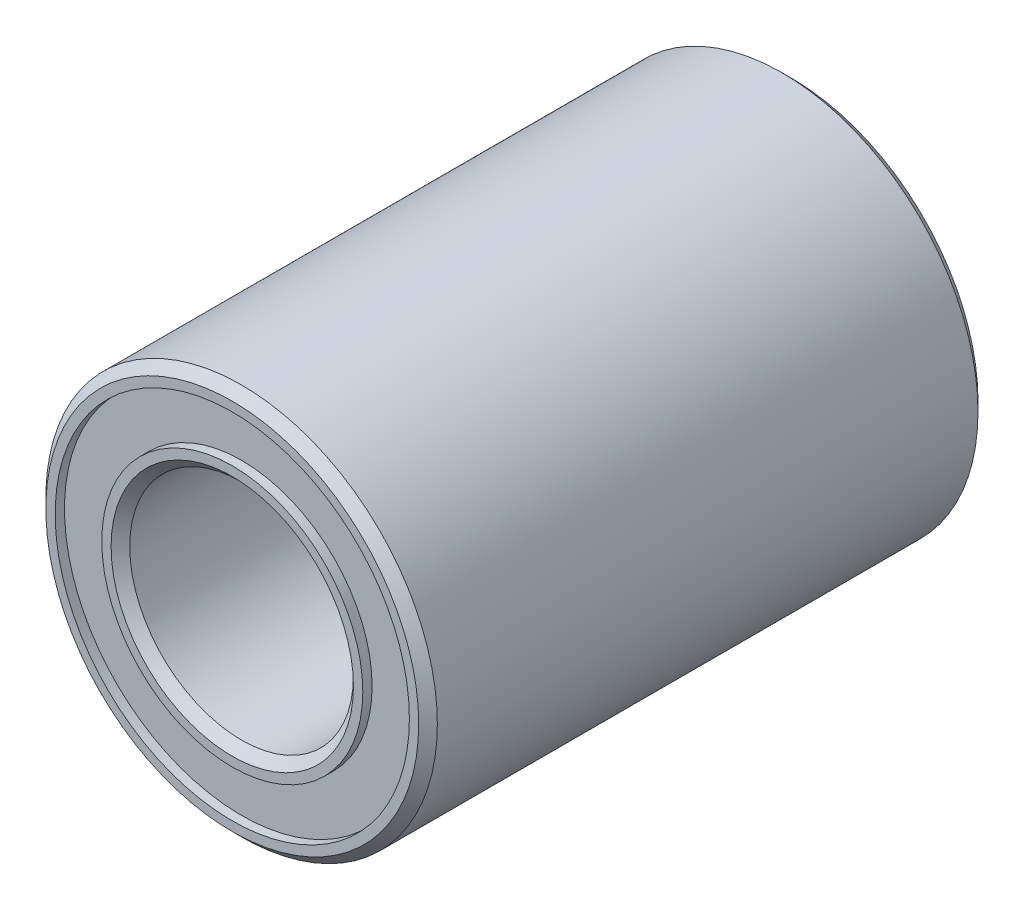
ISO-10303-21;
HEADER;
FILE_DESCRIPTION(('STEP AP214'),'2;1');
FILE_NAME('part.step','',(''),(''),'','','');
FILE_SCHEMA(('AUTOMOTIVE_DESIGN { 1 0 10303 214 1 1 1 1 }'));
ENDSEC;
DATA;
#1=APPLICATION_CONTEXT('core data for automotive mechanical design processes');
#2=APPLICATION_PROTOCOL_DEFINITION('international standard','automotive_design',2000,#1);
#3=PRODUCT_CONTEXT('',#1,'mechanical');
#4=PRODUCT('Part','Part','',(#3));
#5=PRODUCT_RELATED_PRODUCT_CATEGORY('part','',(#4));
#6=PRODUCT_DEFINITION_FORMATION('','',#4);
#7=PRODUCT_DEFINITION_CONTEXT('part definition',#1,'design');
#8=PRODUCT_DEFINITION('design','',#6,#7);
#9=PRODUCT_DEFINITION_SHAPE('','',#8);
#10=(LENGTH_UNIT() NAMED_UNIT(*) SI_UNIT(.MILLI.,.METRE.));
#11=(NAMED_UNIT(*) PLANE_ANGLE_UNIT() SI_UNIT($,.RADIAN.));
#12=(NAMED_UNIT(*) SI_UNIT($,.STERADIAN.) SOLID_ANGLE_UNIT());
#13=UNCERTAINTY_MEASURE_WITH_UNIT(LENGTH_MEASURE(1.E-05),#10,'distance_accuracy_value','');
#14=(GEOMETRIC_REPRESENTATION_CONTEXT(3) GLOBAL_UNCERTAINTY_ASSIGNED_CONTEXT((#13)) GLOBAL_UNIT_ASSIGNED_CONTEXT((#10,
#11,#12)) REPRESENTATION_CONTEXT('',''));
#15=CARTESIAN_POINT('',(0.,0.,0.));
#16=DIRECTION('',(0.,0.,1.));
#17=DIRECTION('',(1.,0.,0.));
#18=AXIS2_PLACEMENT_3D('',#15,#16,#17);
#19=CARTESIAN_POINT('',(0.,0.,0.));
#20=DIRECTION('',(0.,0.,1.));
#21=DIRECTION('',(1.,0.,0.));
#22=AXIS2_PLACEMENT_3D('',#19,#20,#21);
#23=PLANE('',#22);
#24=CARTESIAN_POINT('',(0.,0.,0.));
#25=DIRECTION('',(0.,0.,1.));
#26=DIRECTION('',(1.,0.,0.));
#27=AXIS2_PLACEMENT_3D('',#24,#25,#26);
#28=CIRCLE('',#27,6.5);
#29=CARTESIAN_POINT('',(6.5,0.,0.));
#30=VERTEX_POINT('',#29);
#31=EDGE_CURVE('E72',#30,#30,#28,.T.);
#32=ORIENTED_EDGE('',*,*,#31,.T.);
#33=EDGE_LOOP('',(#32));
#34=FACE_BOUND('',#33,.T.);
#35=CARTESIAN_POINT('',(0.,0.,0.));
#36=DIRECTION('',(0.,0.,-1.));
#37=DIRECTION('',(-1.,0.,0.));
#38=AXIS2_PLACEMENT_3D('',#35,#36,#37);
#39=CIRCLE('',#38,7.);
#40=CARTESIAN_POINT('',(-7.,0.,0.));
#41=VERTEX_POINT('',#40);
#42=EDGE_CURVE('E94',#41,#41,#39,.T.);
#43=ORIENTED_EDGE('',*,*,#42,.T.);
#44=EDGE_LOOP('',(#43));
#45=FACE_BOUND('',#44,.T.);
#46=ADVANCED_FACE('F43',(#34,#45),#23,.F.);
#47=CARTESIAN_POINT('',(0.,0.,30.));
#48=DIRECTION('',(0.,0.,1.));
#49=DIRECTION('',(1.,0.,0.));
#50=AXIS2_PLACEMENT_3D('',#47,#48,#49);
#51=PLANE('',#50);
#52=CARTESIAN_POINT('',(0.,0.,30.));
#53=DIRECTION('',(0.,0.,1.));
#54=DIRECTION('',(1.,0.,0.));
#55=AXIS2_PLACEMENT_3D('',#52,#53,#54);
#56=CIRCLE('',#55,6.5);
#57=CARTESIAN_POINT('',(6.5,0.,30.));
#58=VERTEX_POINT('',#57);
#59=EDGE_CURVE('E63',#58,#58,#56,.F.);
#60=ORIENTED_EDGE('',*,*,#59,.T.);
#61=EDGE_LOOP('',(#60));
#62=FACE_BOUND('',#61,.T.);
#63=CARTESIAN_POINT('',(0.,0.,30.));
#64=DIRECTION('',(0.,0.,1.));
#65=DIRECTION('',(1.,0.,0.));
#66=AXIS2_PLACEMENT_3D('',#63,#64,#65);
#67=CIRCLE('',#66,7.);
#68=CARTESIAN_POINT('',(7.,0.,30.));
#69=VERTEX_POINT('',#68);
#70=EDGE_CURVE('E82',#69,#69,#67,.T.);
#71=ORIENTED_EDGE('',*,*,#70,.T.);
#72=EDGE_LOOP('',(#71));
#73=FACE_BOUND('',#72,.T.);
#74=ADVANCED_FACE('F128',(#62,#73),#51,.T.);
#75=CARTESIAN_POINT('',(0.,0.,30.));
#76=DIRECTION('',(0.,0.,1.));
#77=DIRECTION('',(1.,0.,0.));
#78=AXIS2_PLACEMENT_3D('',#75,#76,#77);
#79=CIRCLE('',#78,10.);
#80=CARTESIAN_POINT('',(10.,0.,30.));
#81=VERTEX_POINT('',#80);
#82=EDGE_CURVE('E10',#81,#81,#79,.T.);
#83=ORIENTED_EDGE('',*,*,#82,.T.);
#84=EDGE_LOOP('',(#83));
#85=FACE_BOUND('',#84,.T.);
#86=CARTESIAN_POINT('',(0.,0.,30.));
#87=DIRECTION('',(0.,0.,1.));
#88=DIRECTION('',(1.,0.,0.));
#89=AXIS2_PLACEMENT_3D('',#86,#87,#88);
#90=CIRCLE('',#89,9.5);
#91=CARTESIAN_POINT('',(9.5,0.,30.));
#92=VERTEX_POINT('',#91);
#93=EDGE_CURVE('E76',#92,#92,#90,.T.);
#94=ORIENTED_EDGE('',*,*,#93,.F.);
#95=EDGE_LOOP('',(#94));
#96=FACE_BOUND('',#95,.T.);
#97=ADVANCED_FACE('F119',(#85,#96),#51,.T.);
#98=CARTESIAN_POINT('',(0.,0.,0.));
#99=DIRECTION('',(0.,0.,1.));
#100=DIRECTION('',(1.,0.,0.));
#101=AXIS2_PLACEMENT_3D('',#98,#99,#100);
#102=CIRCLE('',#101,10.);
#103=CARTESIAN_POINT('',(10.,0.,0.));
#104=VERTEX_POINT('',#103);
#105=EDGE_CURVE('E50',#104,#104,#102,.F.);
#106=ORIENTED_EDGE('',*,*,#105,.T.);
#107=EDGE_LOOP('',(#106));
#108=FACE_BOUND('',#107,.T.);
#109=CARTESIAN_POINT('',(0.,0.,0.));
#110=DIRECTION('',(0.,0.,-1.));
#111=DIRECTION('',(-1.,0.,0.));
#112=AXIS2_PLACEMENT_3D('',#109,#110,#111);
#113=CIRCLE('',#112,9.5);
#114=CARTESIAN_POINT('',(-9.5,0.,0.));
#115=VERTEX_POINT('',#114);
#116=EDGE_CURVE('E88',#115,#115,#113,.T.);
#117=ORIENTED_EDGE('',*,*,#116,.F.);
#118=EDGE_LOOP('',(#117));
#119=FACE_BOUND('',#118,.T.);
#120=ADVANCED_FACE('F116',(#108,#119),#23,.F.);
#121=CARTESIAN_POINT('',(0.,0.,30.));
#122=DIRECTION('',(0.,0.,-1.));
#123=DIRECTION('',(-1.,0.,0.));
#124=AXIS2_PLACEMENT_3D('',#121,#122,#123);
#125=CYLINDRICAL_SURFACE('',#124,10.5);
#126=CARTESIAN_POINT('',(0.,0.,0.5));
#127=DIRECTION('',(0.,0.,1.));
#128=DIRECTION('',(1.,0.,0.));
#129=AXIS2_PLACEMENT_3D('',#126,#127,#128);
#130=CIRCLE('',#129,10.5);
#131=CARTESIAN_POINT('',(10.5,0.,0.5));
#132=VERTEX_POINT('',#131);
#133=EDGE_CURVE('E54',#132,#132,#130,.T.);
#134=ORIENTED_EDGE('',*,*,#133,.T.);
#135=EDGE_LOOP('',(#134));
#136=FACE_BOUND('',#135,.T.);
#137=CARTESIAN_POINT('',(0.,0.,29.5));
#138=DIRECTION('',(0.,0.,1.));
#139=DIRECTION('',(1.,0.,0.));
#140=AXIS2_PLACEMENT_3D('',#137,#138,#139);
#141=CIRCLE('',#140,10.5);
#142=CARTESIAN_POINT('',(10.5,0.,29.5));
#143=VERTEX_POINT('',#142);
#144=EDGE_CURVE('E58',#143,#143,#141,.F.);
#145=ORIENTED_EDGE('',*,*,#144,.T.);
#146=EDGE_LOOP('',(#145));
#147=FACE_BOUND('',#146,.T.);
#148=ADVANCED_FACE('F118',(#136,#147),#125,.T.);
#149=CARTESIAN_POINT('',(0.,0.,30.));
#150=DIRECTION('',(0.,0.,-1.));
#151=DIRECTION('',(-1.,0.,0.));
#152=AXIS2_PLACEMENT_3D('',#149,#150,#151);
#153=CYLINDRICAL_SURFACE('',#152,6.);
#154=CARTESIAN_POINT('',(0.,0.,0.499999999999994));
#155=DIRECTION('',(0.,0.,1.));
#156=DIRECTION('',(1.,0.,0.));
#157=AXIS2_PLACEMENT_3D('',#154,#155,#156);
#158=CIRCLE('',#157,6.);
#159=CARTESIAN_POINT('',(6.,0.,0.499999999999994));
#160=VERTEX_POINT('',#159);
#161=EDGE_CURVE('E66',#160,#160,#158,.F.);
#162=ORIENTED_EDGE('',*,*,#161,.T.);
#163=EDGE_LOOP('',(#162));
#164=FACE_BOUND('',#163,.T.);
#165=CARTESIAN_POINT('',(0.,0.,29.5));
#166=DIRECTION('',(0.,0.,1.));
#167=DIRECTION('',(1.,0.,0.));
#168=AXIS2_PLACEMENT_3D('',#165,#166,#167);
#169=CIRCLE('',#168,6.);
#170=CARTESIAN_POINT('',(6.,0.,29.5));
#171=VERTEX_POINT('',#170);
#172=EDGE_CURVE('E69',#171,#171,#169,.T.);
#173=ORIENTED_EDGE('',*,*,#172,.T.);
#174=EDGE_LOOP('',(#173));
#175=FACE_BOUND('',#174,.T.);
#176=ADVANCED_FACE('F125',(#164,#175),#153,.F.);
#177=CARTESIAN_POINT('',(0.,0.,29.5));
#178=DIRECTION('',(0.,0.,1.));
#179=DIRECTION('',(1.,0.,0.));
#180=AXIS2_PLACEMENT_3D('',#177,#178,#179);
#181=CYLINDRICAL_SURFACE('',#180,9.5);
#182=CARTESIAN_POINT('',(0.,0.,29.5));
#183=DIRECTION('',(0.,0.,1.));
#184=DIRECTION('',(1.,0.,0.));
#185=AXIS2_PLACEMENT_3D('',#182,#183,#184);
#186=CIRCLE('',#185,9.5);
#187=CARTESIAN_POINT('',(9.5,0.,29.5));
#188=VERTEX_POINT('',#187);
#189=EDGE_CURVE('E75',#188,#188,#186,.T.);
#190=ORIENTED_EDGE('',*,*,#189,.F.);
#191=EDGE_LOOP('',(#190));
#192=FACE_BOUND('',#191,.T.);
#193=ORIENTED_EDGE('',*,*,#93,.T.);
#194=EDGE_LOOP('',(#193));
#195=FACE_BOUND('',#194,.T.);
#196=ADVANCED_FACE('F156',(#192,#195),#181,.F.);
#197=CARTESIAN_POINT('',(0.,0.,29.5));
#198=DIRECTION('',(0.,0.,1.));
#199=DIRECTION('',(1.,0.,0.));
#200=AXIS2_PLACEMENT_3D('',#197,#198,#199);
#201=PLANE('',#200);
#202=CARTESIAN_POINT('',(0.,0.,29.5));
#203=DIRECTION('',(0.,0.,1.));
#204=DIRECTION('',(1.,0.,0.));
#205=AXIS2_PLACEMENT_3D('',#202,#203,#204);
#206=CIRCLE('',#205,7.);
#207=CARTESIAN_POINT('',(7.,0.,29.5));
#208=VERTEX_POINT('',#207);
#209=EDGE_CURVE('E79',#208,#208,#206,.T.);
#210=ORIENTED_EDGE('',*,*,#209,.F.);
#211=EDGE_LOOP('',(#210));
#212=FACE_BOUND('',#211,.T.);
#213=ORIENTED_EDGE('',*,*,#189,.T.);
#214=EDGE_LOOP('',(#213));
#215=FACE_BOUND('',#214,.T.);
#216=ADVANCED_FACE('F152',(#212,#215),#201,.T.);
#217=CARTESIAN_POINT('',(0.,0.,29.5));
#218=DIRECTION('',(0.,0.,1.));
#219=DIRECTION('',(1.,0.,0.));
#220=AXIS2_PLACEMENT_3D('',#217,#218,#219);
#221=CYLINDRICAL_SURFACE('',#220,7.);
#222=ORIENTED_EDGE('',*,*,#209,.T.);
#223=EDGE_LOOP('',(#222));
#224=FACE_BOUND('',#223,.T.);
#225=ORIENTED_EDGE('',*,*,#70,.F.);
#226=EDGE_LOOP('',(#225));
#227=FACE_BOUND('',#226,.T.);
#228=ADVANCED_FACE('F112',(#224,#227),#221,.T.);
#229=CARTESIAN_POINT('',(0.,0.,0.5));
#230=DIRECTION('',(0.,0.,-1.));
#231=DIRECTION('',(-1.,0.,0.));
#232=AXIS2_PLACEMENT_3D('',#229,#230,#231);
#233=CYLINDRICAL_SURFACE('',#232,9.5);
#234=CARTESIAN_POINT('',(0.,0.,0.5));
#235=DIRECTION('',(0.,0.,-1.));
#236=DIRECTION('',(-1.,0.,0.));
#237=AXIS2_PLACEMENT_3D('',#234,#235,#236);
#238=CIRCLE('',#237,9.5);
#239=CARTESIAN_POINT('',(-9.5,0.,0.5));
#240=VERTEX_POINT('',#239);
#241=EDGE_CURVE('E85',#240,#240,#238,.T.);
#242=ORIENTED_EDGE('',*,*,#241,.F.);
#243=EDGE_LOOP('',(#242));
#244=FACE_BOUND('',#243,.T.);
#245=ORIENTED_EDGE('',*,*,#116,.T.);
#246=EDGE_LOOP('',(#245));
#247=FACE_BOUND('',#246,.T.);
#248=ADVANCED_FACE('F106',(#244,#247),#233,.F.);
#249=CARTESIAN_POINT('',(0.,0.,0.5));
#250=DIRECTION('',(0.,0.,-1.));
#251=DIRECTION('',(-1.,0.,0.));
#252=AXIS2_PLACEMENT_3D('',#249,#250,#251);
#253=PLANE('',#252);
#254=CARTESIAN_POINT('',(0.,0.,0.5));
#255=DIRECTION('',(0.,0.,-1.));
#256=DIRECTION('',(-1.,0.,0.));
#257=AXIS2_PLACEMENT_3D('',#254,#255,#256);
#258=CIRCLE('',#257,7.);
#259=CARTESIAN_POINT('',(-7.,0.,0.5));
#260=VERTEX_POINT('',#259);
#261=EDGE_CURVE('E91',#260,#260,#258,.T.);
#262=ORIENTED_EDGE('',*,*,#261,.F.);
#263=EDGE_LOOP('',(#262));
#264=FACE_BOUND('',#263,.T.);
#265=ORIENTED_EDGE('',*,*,#241,.T.);
#266=EDGE_LOOP('',(#265));
#267=FACE_BOUND('',#266,.T.);
#268=ADVANCED_FACE('F103',(#264,#267),#253,.T.);
#269=CARTESIAN_POINT('',(0.,0.,0.5));
#270=DIRECTION('',(0.,0.,-1.));
#271=DIRECTION('',(-1.,0.,0.));
#272=AXIS2_PLACEMENT_3D('',#269,#270,#271);
#273=CYLINDRICAL_SURFACE('',#272,7.);
#274=ORIENTED_EDGE('',*,*,#261,.T.);
#275=EDGE_LOOP('',(#274));
#276=FACE_BOUND('',#275,.T.);
#277=ORIENTED_EDGE('',*,*,#42,.F.);
#278=EDGE_LOOP('',(#277));
#279=FACE_BOUND('',#278,.T.);
#280=ADVANCED_FACE('F100',(#276,#279),#273,.T.);
#281=CARTESIAN_POINT('',(0.,0.,0.));
#282=DIRECTION('',(0.,0.,-1.));
#283=DIRECTION('',(-1.,0.,0.));
#284=AXIS2_PLACEMENT_3D('',#281,#282,#283);
#285=CONICAL_SURFACE('',#284,6.5,0.785398163397449);
#286=ORIENTED_EDGE('',*,*,#161,.F.);
#287=EDGE_LOOP('',(#286));
#288=FACE_BOUND('',#287,.T.);
#289=ORIENTED_EDGE('',*,*,#31,.F.);
#290=EDGE_LOOP('',(#289));
#291=FACE_BOUND('',#290,.T.);
#292=ADVANCED_FACE('F140',(#288,#291),#285,.F.);
#293=CARTESIAN_POINT('',(0.,0.,29.5));
#294=DIRECTION('',(0.,0.,1.));
#295=DIRECTION('',(1.,0.,0.));
#296=AXIS2_PLACEMENT_3D('',#293,#294,#295);
#297=CONICAL_SURFACE('',#296,6.,0.78539816339745);
#298=ORIENTED_EDGE('',*,*,#59,.F.);
#299=EDGE_LOOP('',(#298));
#300=FACE_BOUND('',#299,.T.);
#301=ORIENTED_EDGE('',*,*,#172,.F.);
#302=EDGE_LOOP('',(#301));
#303=FACE_BOUND('',#302,.T.);
#304=ADVANCED_FACE('F146',(#300,#303),#297,.F.);
#305=CARTESIAN_POINT('',(0.,0.,0.5));
#306=DIRECTION('',(0.,0.,1.));
#307=DIRECTION('',(1.,0.,0.));
#308=AXIS2_PLACEMENT_3D('',#305,#306,#307);
#309=CONICAL_SURFACE('',#308,10.5,0.785398163397452);
#310=ORIENTED_EDGE('',*,*,#105,.F.);
#311=EDGE_LOOP('',(#310));
#312=FACE_BOUND('',#311,.T.);
#313=ORIENTED_EDGE('',*,*,#133,.F.);
#314=EDGE_LOOP('',(#313));
#315=FACE_BOUND('',#314,.T.);
#316=ADVANCED_FACE('F170',(#312,#315),#309,.T.);
#317=CARTESIAN_POINT('',(0.,0.,30.));
#318=DIRECTION('',(0.,0.,-1.));
#319=DIRECTION('',(-1.,0.,0.));
#320=AXIS2_PLACEMENT_3D('',#317,#318,#319);
#321=CONICAL_SURFACE('',#320,10.,0.785398163397445);
#322=ORIENTED_EDGE('',*,*,#144,.F.);
#323=EDGE_LOOP('',(#322));
#324=FACE_BOUND('',#323,.T.);
#325=ORIENTED_EDGE('',*,*,#82,.F.);
#326=EDGE_LOOP('',(#325));
#327=FACE_BOUND('',#326,.T.);
#328=ADVANCED_FACE('F45',(#324,#327),#321,.T.);
#329=CLOSED_SHELL('',(#46,#74,#97,#120,#148,#176,#196,#216,#228,#248,#268,#280,#292,#304,#316,#328));
#330=MANIFOLD_SOLID_BREP('B2',#329);
#331=ADVANCED_BREP_SHAPE_REPRESENTATION('',(#18,#330),#14);
#332=SHAPE_DEFINITION_REPRESENTATION(#9,#331);
ENDSEC;
END-ISO-10303-21;
